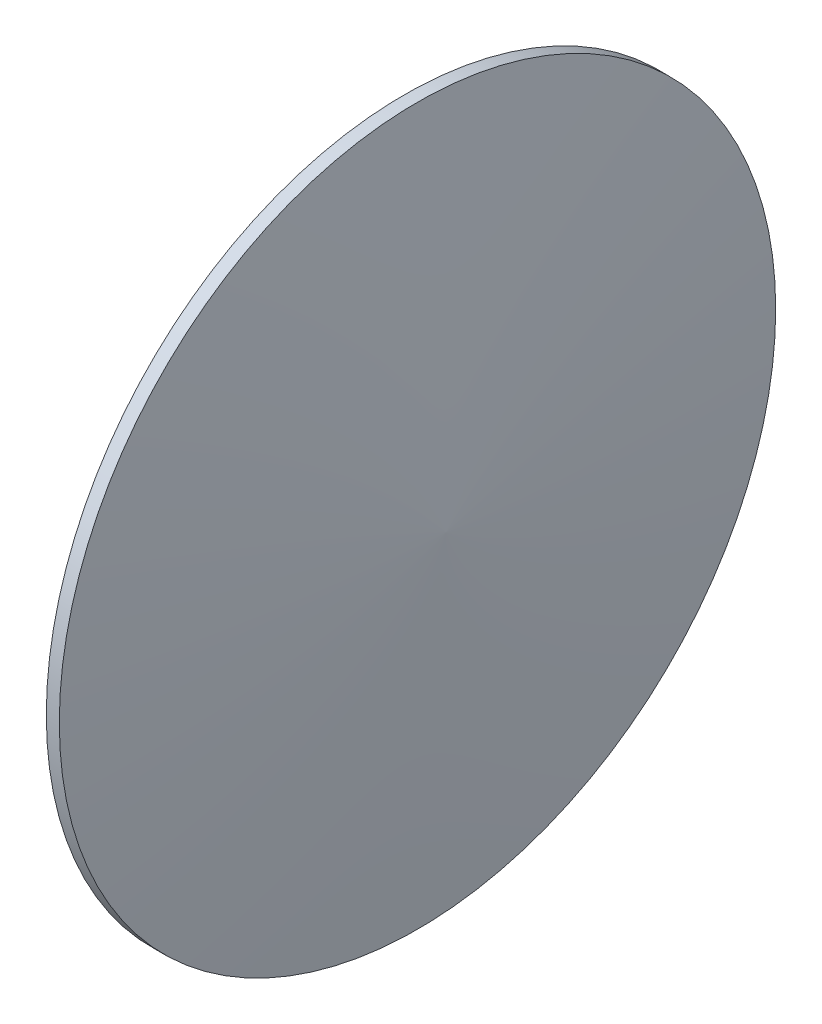
ISO-10303-21;
HEADER;
FILE_DESCRIPTION(('STEP AP214'),'2;1');
FILE_NAME('part.step','',(''),(''),'','','');
FILE_SCHEMA(('AUTOMOTIVE_DESIGN { 1 0 10303 214 1 1 1 1 }'));
ENDSEC;
DATA;
#1=APPLICATION_CONTEXT('core data for automotive mechanical design processes');
#2=APPLICATION_PROTOCOL_DEFINITION('international standard','automotive_design',2000,#1);
#3=PRODUCT_CONTEXT('',#1,'mechanical');
#4=PRODUCT('Part','Part','',(#3));
#5=PRODUCT_RELATED_PRODUCT_CATEGORY('part','',(#4));
#6=PRODUCT_DEFINITION_FORMATION('','',#4);
#7=PRODUCT_DEFINITION_CONTEXT('part definition',#1,'design');
#8=PRODUCT_DEFINITION('design','',#6,#7);
#9=PRODUCT_DEFINITION_SHAPE('','',#8);
#10=(LENGTH_UNIT() NAMED_UNIT(*) SI_UNIT(.MILLI.,.METRE.));
#11=(NAMED_UNIT(*) PLANE_ANGLE_UNIT() SI_UNIT($,.RADIAN.));
#12=(NAMED_UNIT(*) SI_UNIT($,.STERADIAN.) SOLID_ANGLE_UNIT());
#13=UNCERTAINTY_MEASURE_WITH_UNIT(LENGTH_MEASURE(1.E-05),#10,'distance_accuracy_value','');
#14=(GEOMETRIC_REPRESENTATION_CONTEXT(3) GLOBAL_UNCERTAINTY_ASSIGNED_CONTEXT((#13)) GLOBAL_UNIT_ASSIGNED_CONTEXT((#10,
#11,#12)) REPRESENTATION_CONTEXT('',''));
#15=CARTESIAN_POINT('',(0.,0.,0.));
#16=DIRECTION('',(0.,0.,1.));
#17=DIRECTION('',(1.,0.,0.));
#18=AXIS2_PLACEMENT_3D('',#15,#16,#17);
#19=CARTESIAN_POINT('',(0.,9.09059633408145,9.09059633408145));
#20=DIRECTION('',(0.,-1.,0.));
#21=DIRECTION('',(0.,0.,-1.));
#22=AXIS2_PLACEMENT_3D('',#19,#20,#21);
#23=CIRCLE('',#22,144.052820286534);
#24=TRIMMED_CURVE('',#23,(PARAMETER_VALUE(-1.50764837290305)),
(PARAMETER_VALUE(1.50764837290305)),.T.,.PARAMETER.);
#25=CARTESIAN_POINT('',(0.,9.09059633408145,0.));
#26=DIRECTION('',(1.,0.,0.));
#27=AXIS1_PLACEMENT('',#25,#26);
#28=SURFACE_OF_REVOLUTION('',#24,#27);
#29=CARTESIAN_POINT('',(143.386376359895,9.09059633408145,0.));
#30=DIRECTION('',(1.,0.,0.));
#31=DIRECTION('',(0.,0.,-1.));
#32=AXIS2_PLACEMENT_3D('',#29,#30,#31);
#33=CIRCLE('',#32,4.75);
#34=CARTESIAN_POINT('',(143.386376359895,9.09059633408145,-4.75));
#35=VERTEX_POINT('',#34);
#36=EDGE_CURVE('E11',#35,#35,#33,.T.);
#37=ORIENTED_EDGE('',*,*,#36,.T.);
#38=EDGE_LOOP('',(#37));
#39=FACE_BOUND('',#38,.T.);
#40=CARTESIAN_POINT('',(143.765698589042,9.09059633408145,0.));
#41=VERTEX_POINT('',#40);
#42=VERTEX_LOOP('',#41);
#43=FACE_BOUND('',#42,.T.);
#44=ADVANCED_FACE('F36',(#39,#43),#28,.T.);
#45=CARTESIAN_POINT('',(143.765698589042,9.09059633408145,0.));
#46=DIRECTION('',(1.,0.,0.));
#47=DIRECTION('',(0.,0.,-1.));
#48=AXIS2_PLACEMENT_3D('',#45,#46,#47);
#49=CYLINDRICAL_SURFACE('',#48,4.75);
#50=ORIENTED_EDGE('',*,*,#36,.F.);
#51=EDGE_LOOP('',(#50));
#52=FACE_BOUND('',#51,.T.);
#53=CARTESIAN_POINT('',(143.214015058348,9.09059633408145,0.));
#54=DIRECTION('',(1.,0.,0.));
#55=DIRECTION('',(0.,0.,-1.));
#56=AXIS2_PLACEMENT_3D('',#53,#54,#55);
#57=CIRCLE('',#56,4.75);
#58=CARTESIAN_POINT('',(143.214015058348,9.09059633408145,-4.75));
#59=VERTEX_POINT('',#58);
#60=EDGE_CURVE('E43',#59,#59,#57,.T.);
#61=ORIENTED_EDGE('',*,*,#60,.T.);
#62=EDGE_LOOP('',(#61));
#63=FACE_BOUND('',#62,.T.);
#64=ADVANCED_FACE('F50',(#52,#63),#49,.T.);
#65=CARTESIAN_POINT('',(253.408002408094,9.09059633408145,9.09059633408145));
#66=DIRECTION('',(0.,-1.,0.));
#67=DIRECTION('',(0.,0.,-1.));
#68=AXIS2_PLACEMENT_3D('',#65,#66,#67);
#69=CIRCLE('',#68,111.059790000336);
#70=TRIMMED_CURVE('',#69,(PARAMETER_VALUE(-1.48885147402577)),
(PARAMETER_VALUE(1.48885147402577)),.T.,.PARAMETER.);
#71=CARTESIAN_POINT('',(253.408002408094,9.09059633408145,0.));
#72=DIRECTION('',(1.,0.,0.));
#73=AXIS1_PLACEMENT('',#71,#72);
#74=SURFACE_OF_REVOLUTION('',#70,#73);
#75=CARTESIAN_POINT('',(142.720884760151,9.09059633408145,0.));
#76=VERTEX_POINT('',#75);
#77=VERTEX_LOOP('',#76);
#78=FACE_BOUND('',#77,.T.);
#79=ORIENTED_EDGE('',*,*,#60,.F.);
#80=EDGE_LOOP('',(#79));
#81=FACE_BOUND('',#80,.T.);
#82=ADVANCED_FACE('F55',(#78,#81),#74,.T.);
#83=CLOSED_SHELL('',(#44,#64,#82));
#84=MANIFOLD_SOLID_BREP('B2',#83);
#85=ADVANCED_BREP_SHAPE_REPRESENTATION('',(#18,#84),#14);
#86=SHAPE_DEFINITION_REPRESENTATION(#9,#85);
ENDSEC;
END-ISO-10303-21;
